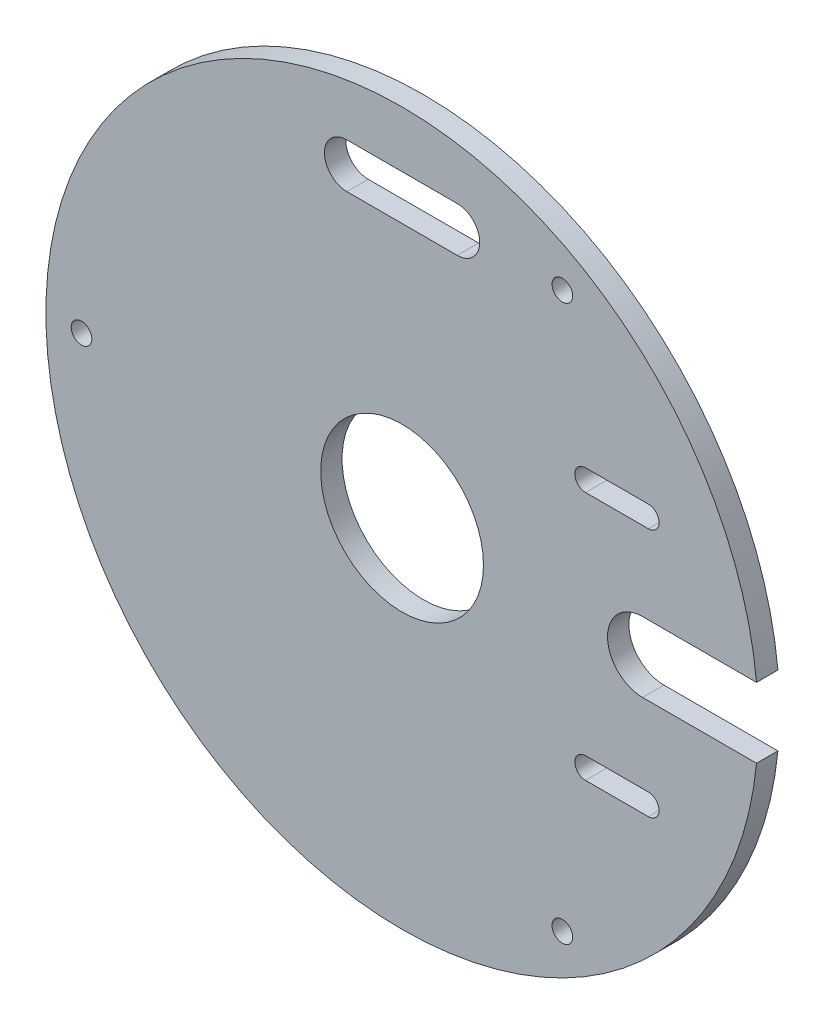
ISO-10303-21;
HEADER;
FILE_DESCRIPTION(('STEP AP214'),'2;1');
FILE_NAME('part.step','',(''),(''),'','','');
FILE_SCHEMA(('AUTOMOTIVE_DESIGN { 1 0 10303 214 1 1 1 1 }'));
ENDSEC;
DATA;
#1=APPLICATION_CONTEXT('core data for automotive mechanical design processes');
#2=APPLICATION_PROTOCOL_DEFINITION('international standard','automotive_design',2000,#1);
#3=PRODUCT_CONTEXT('',#1,'mechanical');
#4=PRODUCT('Part','Part','',(#3));
#5=PRODUCT_RELATED_PRODUCT_CATEGORY('part','',(#4));
#6=PRODUCT_DEFINITION_FORMATION('','',#4);
#7=PRODUCT_DEFINITION_CONTEXT('part definition',#1,'design');
#8=PRODUCT_DEFINITION('design','',#6,#7);
#9=PRODUCT_DEFINITION_SHAPE('','',#8);
#10=(LENGTH_UNIT() NAMED_UNIT(*) SI_UNIT(.MILLI.,.METRE.));
#11=(NAMED_UNIT(*) PLANE_ANGLE_UNIT() SI_UNIT($,.RADIAN.));
#12=(NAMED_UNIT(*) SI_UNIT($,.STERADIAN.) SOLID_ANGLE_UNIT());
#13=UNCERTAINTY_MEASURE_WITH_UNIT(LENGTH_MEASURE(1.E-05),#10,'distance_accuracy_value','');
#14=(GEOMETRIC_REPRESENTATION_CONTEXT(3) GLOBAL_UNCERTAINTY_ASSIGNED_CONTEXT((#13)) GLOBAL_UNIT_ASSIGNED_CONTEXT((#10,
#11,#12)) REPRESENTATION_CONTEXT('',''));
#15=CARTESIAN_POINT('',(0.,0.,0.));
#16=DIRECTION('',(0.,0.,1.));
#17=DIRECTION('',(1.,0.,0.));
#18=AXIS2_PLACEMENT_3D('',#15,#16,#17);
#19=CARTESIAN_POINT('',(22.5,-38.9711431702997,3.));
#20=DIRECTION('',(0.,0.,-1.));
#21=DIRECTION('',(-1.,0.,0.));
#22=AXIS2_PLACEMENT_3D('',#19,#20,#21);
#23=CYLINDRICAL_SURFACE('',#22,1.45);
#24=CARTESIAN_POINT('',(22.5,-38.9711431702997,3.));
#25=DIRECTION('',(0.,0.,1.));
#26=DIRECTION('',(1.,0.,0.));
#27=AXIS2_PLACEMENT_3D('',#24,#25,#26);
#28=CIRCLE('',#27,1.45);
#29=CARTESIAN_POINT('',(23.95,-38.9711431702997,3.));
#30=VERTEX_POINT('',#29);
#31=EDGE_CURVE('E296',#30,#30,#28,.T.);
#32=ORIENTED_EDGE('',*,*,#31,.T.);
#33=EDGE_LOOP('',(#32));
#34=FACE_BOUND('',#33,.T.);
#35=CARTESIAN_POINT('',(22.5,-38.9711431702997,0.));
#36=DIRECTION('',(0.,0.,1.));
#37=DIRECTION('',(1.,0.,0.));
#38=AXIS2_PLACEMENT_3D('',#35,#36,#37);
#39=CIRCLE('',#38,1.45);
#40=CARTESIAN_POINT('',(23.95,-38.9711431702997,0.));
#41=VERTEX_POINT('',#40);
#42=EDGE_CURVE('E277',#41,#41,#39,.T.);
#43=ORIENTED_EDGE('',*,*,#42,.F.);
#44=EDGE_LOOP('',(#43));
#45=FACE_BOUND('',#44,.T.);
#46=ADVANCED_FACE('F41',(#34,#45),#23,.F.);
#47=CARTESIAN_POINT('',(-45.,0.,3.));
#48=DIRECTION('',(0.,0.,-1.));
#49=DIRECTION('',(-1.,0.,0.));
#50=AXIS2_PLACEMENT_3D('',#47,#48,#49);
#51=CYLINDRICAL_SURFACE('',#50,1.45);
#52=CARTESIAN_POINT('',(-45.,0.,3.));
#53=DIRECTION('',(0.,0.,1.));
#54=DIRECTION('',(1.,0.,0.));
#55=AXIS2_PLACEMENT_3D('',#52,#53,#54);
#56=CIRCLE('',#55,1.45);
#57=CARTESIAN_POINT('',(-43.55,0.,3.));
#58=VERTEX_POINT('',#57);
#59=EDGE_CURVE('E301',#58,#58,#56,.T.);
#60=ORIENTED_EDGE('',*,*,#59,.T.);
#61=EDGE_LOOP('',(#60));
#62=FACE_BOUND('',#61,.T.);
#63=CARTESIAN_POINT('',(-45.,0.,0.));
#64=DIRECTION('',(0.,0.,1.));
#65=DIRECTION('',(1.,0.,0.));
#66=AXIS2_PLACEMENT_3D('',#63,#64,#65);
#67=CIRCLE('',#66,1.45);
#68=CARTESIAN_POINT('',(-43.55,0.,0.));
#69=VERTEX_POINT('',#68);
#70=EDGE_CURVE('E283',#69,#69,#67,.T.);
#71=ORIENTED_EDGE('',*,*,#70,.F.);
#72=EDGE_LOOP('',(#71));
#73=FACE_BOUND('',#72,.T.);
#74=ADVANCED_FACE('F412',(#62,#73),#51,.F.);
#75=CARTESIAN_POINT('',(22.5,38.9711431702997,3.));
#76=DIRECTION('',(0.,0.,-1.));
#77=DIRECTION('',(-1.,0.,0.));
#78=AXIS2_PLACEMENT_3D('',#75,#76,#77);
#79=CYLINDRICAL_SURFACE('',#78,1.45);
#80=CARTESIAN_POINT('',(22.5,38.9711431702997,3.));
#81=DIRECTION('',(0.,0.,1.));
#82=DIRECTION('',(1.,0.,0.));
#83=AXIS2_PLACEMENT_3D('',#80,#81,#82);
#84=CIRCLE('',#83,1.45);
#85=CARTESIAN_POINT('',(23.95,38.9711431702997,3.));
#86=VERTEX_POINT('',#85);
#87=EDGE_CURVE('E280',#86,#86,#84,.T.);
#88=ORIENTED_EDGE('',*,*,#87,.T.);
#89=EDGE_LOOP('',(#88));
#90=FACE_BOUND('',#89,.T.);
#91=CARTESIAN_POINT('',(22.5,38.9711431702997,0.));
#92=DIRECTION('',(0.,0.,1.));
#93=DIRECTION('',(1.,0.,0.));
#94=AXIS2_PLACEMENT_3D('',#91,#92,#93);
#95=CIRCLE('',#94,1.45);
#96=CARTESIAN_POINT('',(23.95,38.9711431702997,0.));
#97=VERTEX_POINT('',#96);
#98=EDGE_CURVE('E288',#97,#97,#95,.T.);
#99=ORIENTED_EDGE('',*,*,#98,.F.);
#100=EDGE_LOOP('',(#99));
#101=FACE_BOUND('',#100,.T.);
#102=ADVANCED_FACE('F418',(#90,#101),#79,.F.);
#103=CARTESIAN_POINT('',(0.,0.,3.));
#104=DIRECTION('',(0.,0.,-1.));
#105=DIRECTION('',(-1.,0.,0.));
#106=AXIS2_PLACEMENT_3D('',#103,#104,#105);
#107=CYLINDRICAL_SURFACE('',#106,11.425);
#108=CARTESIAN_POINT('',(0.,0.,3.));
#109=DIRECTION('',(0.,0.,1.));
#110=DIRECTION('',(1.,0.,0.));
#111=AXIS2_PLACEMENT_3D('',#108,#109,#110);
#112=CIRCLE('',#111,11.425);
#113=CARTESIAN_POINT('',(11.425,0.,3.));
#114=VERTEX_POINT('',#113);
#115=EDGE_CURVE('E276',#114,#114,#112,.T.);
#116=ORIENTED_EDGE('',*,*,#115,.T.);
#117=EDGE_LOOP('',(#116));
#118=FACE_BOUND('',#117,.T.);
#119=CARTESIAN_POINT('',(0.,0.,0.));
#120=DIRECTION('',(0.,0.,1.));
#121=DIRECTION('',(1.,0.,0.));
#122=AXIS2_PLACEMENT_3D('',#119,#120,#121);
#123=CIRCLE('',#122,11.425);
#124=CARTESIAN_POINT('',(11.425,0.,0.));
#125=VERTEX_POINT('',#124);
#126=EDGE_CURVE('E291',#125,#125,#123,.T.);
#127=ORIENTED_EDGE('',*,*,#126,.F.);
#128=EDGE_LOOP('',(#127));
#129=FACE_BOUND('',#128,.T.);
#130=ADVANCED_FACE('F43',(#118,#129),#107,.F.);
#131=CARTESIAN_POINT('',(0.,0.,3.));
#132=DIRECTION('',(0.,0.,-1.));
#133=DIRECTION('',(-1.,0.,0.));
#134=AXIS2_PLACEMENT_3D('',#131,#132,#133);
#135=CYLINDRICAL_SURFACE('',#134,50.);
#136=CARTESIAN_POINT('',(0.,0.,3.));
#137=DIRECTION('',(0.,0.,1.));
#138=DIRECTION('',(1.,0.,0.));
#139=AXIS2_PLACEMENT_3D('',#136,#137,#138);
#140=CIRCLE('',#139,50.);
#141=CARTESIAN_POINT('',(49.7579720691289,4.91367638004216,3.));
#142=VERTEX_POINT('',#141);
#143=CARTESIAN_POINT('',(49.7579720691289,-4.91367638004216,3.));
#144=VERTEX_POINT('',#143);
#145=EDGE_CURVE('E49',#142,#144,#140,.T.);
#146=ORIENTED_EDGE('',*,*,#145,.F.);
#147=DIRECTION('',(0.,0.,-1.));
#148=VECTOR('',#147,1.);
#149=CARTESIAN_POINT('',(49.7579720691289,4.91367638004216,3.));
#150=LINE('',#149,#148);
#151=CARTESIAN_POINT('',(49.7579720691289,4.91367638004216,0.));
#152=VERTEX_POINT('',#151);
#153=EDGE_CURVE('E234',#142,#152,#150,.T.);
#154=ORIENTED_EDGE('',*,*,#153,.T.);
#155=CARTESIAN_POINT('',(0.,0.,0.));
#156=DIRECTION('',(0.,0.,1.));
#157=DIRECTION('',(1.,0.,0.));
#158=AXIS2_PLACEMENT_3D('',#155,#156,#157);
#159=CIRCLE('',#158,50.);
#160=CARTESIAN_POINT('',(49.7579720691289,-4.91367638004216,0.));
#161=VERTEX_POINT('',#160);
#162=EDGE_CURVE('E268',#152,#161,#159,.T.);
#163=ORIENTED_EDGE('',*,*,#162,.T.);
#164=DIRECTION('',(0.,0.,-1.));
#165=VECTOR('',#164,1.);
#166=CARTESIAN_POINT('',(49.7579720691289,-4.91367638004216,3.));
#167=LINE('',#166,#165);
#168=EDGE_CURVE('E216',#161,#144,#167,.F.);
#169=ORIENTED_EDGE('',*,*,#168,.T.);
#170=EDGE_LOOP('',(#146,#154,#163,#169));
#171=FACE_BOUND('',#170,.T.);
#172=ADVANCED_FACE('F266',(#171),#135,.T.);
#173=CARTESIAN_POINT('',(0.,0.,3.));
#174=DIRECTION('',(0.,0.,1.));
#175=DIRECTION('',(1.,0.,0.));
#176=AXIS2_PLACEMENT_3D('',#173,#174,#175);
#177=PLANE('',#176);
#178=CARTESIAN_POINT('',(34.5735541658757,-17.5,3.));
#179=DIRECTION('',(0.,0.,1.));
#180=DIRECTION('',(1.,0.,0.));
#181=AXIS2_PLACEMENT_3D('',#178,#179,#180);
#182=CIRCLE('',#181,1.5);
#183=CARTESIAN_POINT('',(34.5735541658757,-19.,3.));
#184=VERTEX_POINT('',#183);
#185=CARTESIAN_POINT('',(34.5735541658757,-16.,3.));
#186=VERTEX_POINT('',#185);
#187=EDGE_CURVE('E367',#184,#186,#182,.T.);
#188=ORIENTED_EDGE('',*,*,#187,.F.);
#189=DIRECTION('',(1.,0.,0.));
#190=VECTOR('',#189,1.);
#191=CARTESIAN_POINT('',(0.,-19.,3.));
#192=LINE('',#191,#190);
#193=CARTESIAN_POINT('',(25.7538897565406,-19.,3.));
#194=VERTEX_POINT('',#193);
#195=EDGE_CURVE('E250',#194,#184,#192,.T.);
#196=ORIENTED_EDGE('',*,*,#195,.F.);
#197=CARTESIAN_POINT('',(25.7538897565406,-17.5,3.));
#198=DIRECTION('',(0.,0.,1.));
#199=DIRECTION('',(1.,0.,0.));
#200=AXIS2_PLACEMENT_3D('',#197,#198,#199);
#201=CIRCLE('',#200,1.5);
#202=CARTESIAN_POINT('',(25.7538897565406,-16.,3.));
#203=VERTEX_POINT('',#202);
#204=EDGE_CURVE('E376',#203,#194,#201,.T.);
#205=ORIENTED_EDGE('',*,*,#204,.F.);
#206=DIRECTION('',(-1.,0.,0.));
#207=VECTOR('',#206,1.);
#208=CARTESIAN_POINT('',(0.,-16.,3.));
#209=LINE('',#208,#207);
#210=EDGE_CURVE('E369',#186,#203,#209,.T.);
#211=ORIENTED_EDGE('',*,*,#210,.F.);
#212=EDGE_LOOP('',(#188,#196,#205,#211));
#213=FACE_BOUND('',#212,.T.);
#214=CARTESIAN_POINT('',(34.5735541658757,17.5,3.));
#215=DIRECTION('',(0.,0.,1.));
#216=DIRECTION('',(1.,0.,0.));
#217=AXIS2_PLACEMENT_3D('',#214,#215,#216);
#218=CIRCLE('',#217,1.5);
#219=CARTESIAN_POINT('',(34.5735541658757,16.,3.));
#220=VERTEX_POINT('',#219);
#221=CARTESIAN_POINT('',(34.5735541658757,19.,3.));
#222=VERTEX_POINT('',#221);
#223=EDGE_CURVE('E245',#220,#222,#218,.T.);
#224=ORIENTED_EDGE('',*,*,#223,.F.);
#225=DIRECTION('',(1.,0.,0.));
#226=VECTOR('',#225,1.);
#227=CARTESIAN_POINT('',(0.,16.,3.));
#228=LINE('',#227,#226);
#229=CARTESIAN_POINT('',(25.7538897565406,16.,3.));
#230=VERTEX_POINT('',#229);
#231=EDGE_CURVE('E257',#230,#220,#228,.T.);
#232=ORIENTED_EDGE('',*,*,#231,.F.);
#233=CARTESIAN_POINT('',(25.7538897565406,17.5,3.));
#234=DIRECTION('',(0.,0.,1.));
#235=DIRECTION('',(1.,0.,0.));
#236=AXIS2_PLACEMENT_3D('',#233,#234,#235);
#237=CIRCLE('',#236,1.5);
#238=CARTESIAN_POINT('',(25.7538897565406,19.,3.));
#239=VERTEX_POINT('',#238);
#240=EDGE_CURVE('E159',#239,#230,#237,.T.);
#241=ORIENTED_EDGE('',*,*,#240,.F.);
#242=DIRECTION('',(-1.,0.,0.));
#243=VECTOR('',#242,1.);
#244=CARTESIAN_POINT('',(0.,19.,3.));
#245=LINE('',#244,#243);
#246=EDGE_CURVE('E241',#222,#239,#245,.T.);
#247=ORIENTED_EDGE('',*,*,#246,.F.);
#248=EDGE_LOOP('',(#224,#232,#241,#247));
#249=FACE_BOUND('',#248,.T.);
#250=DIRECTION('',(-1.,0.,0.));
#251=VECTOR('',#250,1.);
#252=CARTESIAN_POINT('',(0.,4.91367638004216,3.));
#253=LINE('',#252,#251);
#254=CARTESIAN_POINT('',(33.7538897565406,4.91367638004216,3.));
#255=VERTEX_POINT('',#254);
#256=EDGE_CURVE('E230',#142,#255,#253,.T.);
#257=ORIENTED_EDGE('',*,*,#256,.F.);
#258=ORIENTED_EDGE('',*,*,#145,.T.);
#259=DIRECTION('',(1.,0.,0.));
#260=VECTOR('',#259,1.);
#261=CARTESIAN_POINT('',(0.,-4.91367638004216,3.));
#262=LINE('',#261,#260);
#263=CARTESIAN_POINT('',(33.7538897565406,-4.91367638004216,3.));
#264=VERTEX_POINT('',#263);
#265=EDGE_CURVE('E211',#264,#144,#262,.T.);
#266=ORIENTED_EDGE('',*,*,#265,.F.);
#267=CARTESIAN_POINT('',(33.7538897565406,0.,3.));
#268=DIRECTION('',(0.,0.,1.));
#269=DIRECTION('',(1.,0.,0.));
#270=AXIS2_PLACEMENT_3D('',#267,#268,#269);
#271=CIRCLE('',#270,4.91367638004216);
#272=EDGE_CURVE('E226',#255,#264,#271,.T.);
#273=ORIENTED_EDGE('',*,*,#272,.F.);
#274=EDGE_LOOP('',(#257,#258,#266,#273));
#275=FACE_BOUND('',#274,.T.);
#276=CARTESIAN_POINT('',(7.75,38.9711431702997,3.));
#277=DIRECTION('',(0.,0.,1.));
#278=DIRECTION('',(1.,0.,0.));
#279=AXIS2_PLACEMENT_3D('',#276,#277,#278);
#280=CIRCLE('',#279,3.14884540248456);
#281=CARTESIAN_POINT('',(7.75,35.8222977678152,3.));
#282=VERTEX_POINT('',#281);
#283=CARTESIAN_POINT('',(7.75,42.1199885727843,3.));
#284=VERTEX_POINT('',#283);
#285=EDGE_CURVE('E327',#282,#284,#280,.T.);
#286=ORIENTED_EDGE('',*,*,#285,.F.);
#287=DIRECTION('',(1.,0.,0.));
#288=VECTOR('',#287,1.);
#289=CARTESIAN_POINT('',(0.,35.8222977678152,3.));
#290=LINE('',#289,#288);
#291=CARTESIAN_POINT('',(-7.75,35.8222977678152,3.));
#292=VERTEX_POINT('',#291);
#293=EDGE_CURVE('E321',#292,#282,#290,.T.);
#294=ORIENTED_EDGE('',*,*,#293,.F.);
#295=CARTESIAN_POINT('',(-7.75,38.9711431702997,3.));
#296=DIRECTION('',(0.,0.,1.));
#297=DIRECTION('',(1.,0.,0.));
#298=AXIS2_PLACEMENT_3D('',#295,#296,#297);
#299=CIRCLE('',#298,3.14884540248456);
#300=CARTESIAN_POINT('',(-7.75,42.1199885727843,3.));
#301=VERTEX_POINT('',#300);
#302=EDGE_CURVE('E293',#301,#292,#299,.T.);
#303=ORIENTED_EDGE('',*,*,#302,.F.);
#304=DIRECTION('',(1.,0.,0.));
#305=VECTOR('',#304,1.);
#306=CARTESIAN_POINT('',(0.,42.1199885727843,3.));
#307=LINE('',#306,#305);
#308=EDGE_CURVE('E364',#301,#284,#307,.T.);
#309=ORIENTED_EDGE('',*,*,#308,.T.);
#310=EDGE_LOOP('',(#286,#294,#303,#309));
#311=FACE_BOUND('',#310,.T.);
#312=ORIENTED_EDGE('',*,*,#115,.F.);
#313=EDGE_LOOP('',(#312));
#314=FACE_BOUND('',#313,.T.);
#315=ORIENTED_EDGE('',*,*,#87,.F.);
#316=EDGE_LOOP('',(#315));
#317=FACE_BOUND('',#316,.T.);
#318=ORIENTED_EDGE('',*,*,#59,.F.);
#319=EDGE_LOOP('',(#318));
#320=FACE_BOUND('',#319,.T.);
#321=ORIENTED_EDGE('',*,*,#31,.F.);
#322=EDGE_LOOP('',(#321));
#323=FACE_BOUND('',#322,.T.);
#324=ADVANCED_FACE('F362',(#213,#249,#275,#311,#314,#317,#320,#323),#177,.T.);
#325=CARTESIAN_POINT('',(0.,0.,0.));
#326=DIRECTION('',(0.,0.,1.));
#327=DIRECTION('',(1.,0.,0.));
#328=AXIS2_PLACEMENT_3D('',#325,#326,#327);
#329=PLANE('',#328);
#330=DIRECTION('',(-1.,0.,0.));
#331=VECTOR('',#330,1.);
#332=CARTESIAN_POINT('',(34.5735541658757,-19.,0.));
#333=LINE('',#332,#331);
#334=CARTESIAN_POINT('',(34.5735541658757,-19.,0.));
#335=VERTEX_POINT('',#334);
#336=CARTESIAN_POINT('',(25.7538897565406,-19.,0.));
#337=VERTEX_POINT('',#336);
#338=EDGE_CURVE('E188',#335,#337,#333,.T.);
#339=ORIENTED_EDGE('',*,*,#338,.F.);
#340=CARTESIAN_POINT('',(34.5735541658757,-17.5,0.));
#341=DIRECTION('',(0.,0.,-1.));
#342=DIRECTION('',(1.,0.,0.));
#343=AXIS2_PLACEMENT_3D('',#340,#341,#342);
#344=CIRCLE('',#343,1.5);
#345=CARTESIAN_POINT('',(34.5735541658757,-16.,0.));
#346=VERTEX_POINT('',#345);
#347=EDGE_CURVE('E186',#346,#335,#344,.T.);
#348=ORIENTED_EDGE('',*,*,#347,.F.);
#349=DIRECTION('',(1.,0.,0.));
#350=VECTOR('',#349,1.);
#351=CARTESIAN_POINT('',(34.5735541658757,-16.,0.));
#352=LINE('',#351,#350);
#353=CARTESIAN_POINT('',(25.7538897565406,-16.,0.));
#354=VERTEX_POINT('',#353);
#355=EDGE_CURVE('E193',#354,#346,#352,.T.);
#356=ORIENTED_EDGE('',*,*,#355,.F.);
#357=CARTESIAN_POINT('',(25.7538897565406,-17.5,0.));
#358=DIRECTION('',(0.,0.,-1.));
#359=DIRECTION('',(1.,0.,0.));
#360=AXIS2_PLACEMENT_3D('',#357,#358,#359);
#361=CIRCLE('',#360,1.5);
#362=EDGE_CURVE('E190',#337,#354,#361,.T.);
#363=ORIENTED_EDGE('',*,*,#362,.F.);
#364=EDGE_LOOP('',(#339,#348,#356,#363));
#365=FACE_BOUND('',#364,.T.);
#366=DIRECTION('',(-1.,0.,0.));
#367=VECTOR('',#366,1.);
#368=CARTESIAN_POINT('',(34.5735541658757,16.,0.));
#369=LINE('',#368,#367);
#370=CARTESIAN_POINT('',(34.5735541658757,16.,0.));
#371=VERTEX_POINT('',#370);
#372=CARTESIAN_POINT('',(25.7538897565406,16.,0.));
#373=VERTEX_POINT('',#372);
#374=EDGE_CURVE('E166',#371,#373,#369,.T.);
#375=ORIENTED_EDGE('',*,*,#374,.F.);
#376=CARTESIAN_POINT('',(34.5735541658757,17.5,0.));
#377=DIRECTION('',(0.,0.,-1.));
#378=DIRECTION('',(-1.,0.,0.));
#379=AXIS2_PLACEMENT_3D('',#376,#377,#378);
#380=CIRCLE('',#379,1.5);
#381=CARTESIAN_POINT('',(34.5735541658757,19.,0.));
#382=VERTEX_POINT('',#381);
#383=EDGE_CURVE('E171',#382,#371,#380,.T.);
#384=ORIENTED_EDGE('',*,*,#383,.F.);
#385=DIRECTION('',(1.,0.,0.));
#386=VECTOR('',#385,1.);
#387=CARTESIAN_POINT('',(34.5735541658757,19.,0.));
#388=LINE('',#387,#386);
#389=CARTESIAN_POINT('',(25.7538897565406,19.,0.));
#390=VERTEX_POINT('',#389);
#391=EDGE_CURVE('E176',#390,#382,#388,.T.);
#392=ORIENTED_EDGE('',*,*,#391,.F.);
#393=CARTESIAN_POINT('',(25.7538897565406,17.5,0.));
#394=DIRECTION('',(0.,0.,-1.));
#395=DIRECTION('',(-1.,0.,0.));
#396=AXIS2_PLACEMENT_3D('',#393,#394,#395);
#397=CIRCLE('',#396,1.5);
#398=EDGE_CURVE('E156',#373,#390,#397,.T.);
#399=ORIENTED_EDGE('',*,*,#398,.F.);
#400=EDGE_LOOP('',(#375,#384,#392,#399));
#401=FACE_BOUND('',#400,.T.);
#402=DIRECTION('',(1.,0.,0.));
#403=VECTOR('',#402,1.);
#404=CARTESIAN_POINT('',(0.,35.8222977678152,0.));
#405=LINE('',#404,#403);
#406=CARTESIAN_POINT('',(-7.75,35.8222977678152,0.));
#407=VERTEX_POINT('',#406);
#408=CARTESIAN_POINT('',(7.75,35.8222977678152,0.));
#409=VERTEX_POINT('',#408);
#410=EDGE_CURVE('E326',#407,#409,#405,.T.);
#411=ORIENTED_EDGE('',*,*,#410,.T.);
#412=CARTESIAN_POINT('',(7.75,38.9711431702997,0.));
#413=DIRECTION('',(0.,0.,1.));
#414=DIRECTION('',(1.,0.,0.));
#415=AXIS2_PLACEMENT_3D('',#412,#413,#414);
#416=CIRCLE('',#415,3.14884540248456);
#417=CARTESIAN_POINT('',(7.75,42.1199885727843,0.));
#418=VERTEX_POINT('',#417);
#419=EDGE_CURVE('E331',#409,#418,#416,.T.);
#420=ORIENTED_EDGE('',*,*,#419,.T.);
#421=DIRECTION('',(1.,0.,0.));
#422=VECTOR('',#421,1.);
#423=CARTESIAN_POINT('',(0.,42.1199885727843,0.));
#424=LINE('',#423,#422);
#425=CARTESIAN_POINT('',(-7.75,42.1199885727843,0.));
#426=VERTEX_POINT('',#425);
#427=EDGE_CURVE('E334',#426,#418,#424,.T.);
#428=ORIENTED_EDGE('',*,*,#427,.F.);
#429=CARTESIAN_POINT('',(-7.75,38.9711431702997,0.));
#430=DIRECTION('',(0.,0.,1.));
#431=DIRECTION('',(1.,0.,0.));
#432=AXIS2_PLACEMENT_3D('',#429,#430,#431);
#433=CIRCLE('',#432,3.14884540248456);
#434=EDGE_CURVE('E337',#426,#407,#433,.T.);
#435=ORIENTED_EDGE('',*,*,#434,.T.);
#436=EDGE_LOOP('',(#411,#420,#428,#435));
#437=FACE_BOUND('',#436,.T.);
#438=ORIENTED_EDGE('',*,*,#126,.T.);
#439=EDGE_LOOP('',(#438));
#440=FACE_BOUND('',#439,.T.);
#441=ORIENTED_EDGE('',*,*,#98,.T.);
#442=EDGE_LOOP('',(#441));
#443=FACE_BOUND('',#442,.T.);
#444=ORIENTED_EDGE('',*,*,#70,.T.);
#445=EDGE_LOOP('',(#444));
#446=FACE_BOUND('',#445,.T.);
#447=ORIENTED_EDGE('',*,*,#42,.T.);
#448=EDGE_LOOP('',(#447));
#449=FACE_BOUND('',#448,.T.);
#450=ORIENTED_EDGE('',*,*,#162,.F.);
#451=DIRECTION('',(1.,0.,0.));
#452=VECTOR('',#451,1.);
#453=CARTESIAN_POINT('',(50.4926761863821,4.91367638004216,0.));
#454=LINE('',#453,#452);
#455=CARTESIAN_POINT('',(33.7538897565406,4.91367638004216,0.));
#456=VERTEX_POINT('',#455);
#457=EDGE_CURVE('E206',#456,#152,#454,.T.);
#458=ORIENTED_EDGE('',*,*,#457,.F.);
#459=CARTESIAN_POINT('',(33.7538897565406,0.,0.));
#460=DIRECTION('',(0.,0.,-1.));
#461=DIRECTION('',(-1.,0.,0.));
#462=AXIS2_PLACEMENT_3D('',#459,#460,#461);
#463=CIRCLE('',#462,4.91367638004216);
#464=CARTESIAN_POINT('',(33.7538897565406,-4.91367638004216,0.));
#465=VERTEX_POINT('',#464);
#466=EDGE_CURVE('E183',#465,#456,#463,.T.);
#467=ORIENTED_EDGE('',*,*,#466,.F.);
#468=DIRECTION('',(1.,0.,0.));
#469=VECTOR('',#468,1.);
#470=CARTESIAN_POINT('',(0.,-4.91367638004216,0.));
#471=LINE('',#470,#469);
#472=EDGE_CURVE('E12',#465,#161,#471,.T.);
#473=ORIENTED_EDGE('',*,*,#472,.T.);
#474=EDGE_LOOP('',(#450,#458,#467,#473));
#475=FACE_BOUND('',#474,.T.);
#476=ADVANCED_FACE('F173',(#365,#401,#437,#440,#443,#446,#449,#475),#329,.F.);
#477=CARTESIAN_POINT('',(0.,35.8222977678152,3.001));
#478=DIRECTION('',(0.,1.,0.));
#479=DIRECTION('',(0.,0.,1.));
#480=AXIS2_PLACEMENT_3D('',#477,#478,#479);
#481=PLANE('',#480);
#482=ORIENTED_EDGE('',*,*,#293,.T.);
#483=DIRECTION('',(0.,0.,-1.));
#484=VECTOR('',#483,1.);
#485=CARTESIAN_POINT('',(7.75,35.8222977678152,3.001));
#486=LINE('',#485,#484);
#487=EDGE_CURVE('E318',#282,#409,#486,.T.);
#488=ORIENTED_EDGE('',*,*,#487,.T.);
#489=ORIENTED_EDGE('',*,*,#410,.F.);
#490=DIRECTION('',(0.,0.,-1.));
#491=VECTOR('',#490,1.);
#492=CARTESIAN_POINT('',(-7.75,35.8222977678152,3.001));
#493=LINE('',#492,#491);
#494=EDGE_CURVE('E340',#292,#407,#493,.T.);
#495=ORIENTED_EDGE('',*,*,#494,.F.);
#496=EDGE_LOOP('',(#482,#488,#489,#495));
#497=FACE_BOUND('',#496,.T.);
#498=ADVANCED_FACE('F349',(#497),#481,.T.);
#499=CARTESIAN_POINT('',(7.75,38.9711431702997,3.001));
#500=DIRECTION('',(0.,0.,-1.));
#501=DIRECTION('',(-1.,0.,0.));
#502=AXIS2_PLACEMENT_3D('',#499,#500,#501);
#503=CYLINDRICAL_SURFACE('',#502,3.14884540248456);
#504=ORIENTED_EDGE('',*,*,#285,.T.);
#505=DIRECTION('',(0.,0.,-1.));
#506=VECTOR('',#505,1.);
#507=CARTESIAN_POINT('',(7.75,42.1199885727843,3.001));
#508=LINE('',#507,#506);
#509=EDGE_CURVE('E344',#284,#418,#508,.T.);
#510=ORIENTED_EDGE('',*,*,#509,.T.);
#511=ORIENTED_EDGE('',*,*,#419,.F.);
#512=ORIENTED_EDGE('',*,*,#487,.F.);
#513=EDGE_LOOP('',(#504,#510,#511,#512));
#514=FACE_BOUND('',#513,.T.);
#515=ADVANCED_FACE('F352',(#514),#503,.F.);
#516=CARTESIAN_POINT('',(0.,42.1199885727843,3.001));
#517=DIRECTION('',(0.,1.,0.));
#518=DIRECTION('',(0.,0.,1.));
#519=AXIS2_PLACEMENT_3D('',#516,#517,#518);
#520=PLANE('',#519);
#521=DIRECTION('',(0.,0.,-1.));
#522=VECTOR('',#521,1.);
#523=CARTESIAN_POINT('',(-7.75,42.1199885727843,3.001));
#524=LINE('',#523,#522);
#525=EDGE_CURVE('E343',#301,#426,#524,.T.);
#526=ORIENTED_EDGE('',*,*,#525,.T.);
#527=ORIENTED_EDGE('',*,*,#427,.T.);
#528=ORIENTED_EDGE('',*,*,#509,.F.);
#529=ORIENTED_EDGE('',*,*,#308,.F.);
#530=EDGE_LOOP('',(#526,#527,#528,#529));
#531=FACE_BOUND('',#530,.T.);
#532=ADVANCED_FACE('F567',(#531),#520,.F.);
#533=CARTESIAN_POINT('',(-7.75,38.9711431702997,3.001));
#534=DIRECTION('',(0.,0.,-1.));
#535=DIRECTION('',(-1.,0.,0.));
#536=AXIS2_PLACEMENT_3D('',#533,#534,#535);
#537=CYLINDRICAL_SURFACE('',#536,3.14884540248456);
#538=ORIENTED_EDGE('',*,*,#302,.T.);
#539=ORIENTED_EDGE('',*,*,#494,.T.);
#540=ORIENTED_EDGE('',*,*,#434,.F.);
#541=ORIENTED_EDGE('',*,*,#525,.F.);
#542=EDGE_LOOP('',(#538,#539,#540,#541));
#543=FACE_BOUND('',#542,.T.);
#544=ADVANCED_FACE('F358',(#543),#537,.F.);
#545=CARTESIAN_POINT('',(50.4926761863821,4.91367638004216,10.));
#546=DIRECTION('',(0.,1.,0.));
#547=DIRECTION('',(0.,0.,1.));
#548=AXIS2_PLACEMENT_3D('',#545,#546,#547);
#549=PLANE('',#548);
#550=ORIENTED_EDGE('',*,*,#256,.T.);
#551=DIRECTION('',(0.,0.,-1.));
#552=VECTOR('',#551,1.);
#553=CARTESIAN_POINT('',(33.7538897565406,4.91367638004216,10.));
#554=LINE('',#553,#552);
#555=EDGE_CURVE('E209',#255,#456,#554,.T.);
#556=ORIENTED_EDGE('',*,*,#555,.T.);
#557=ORIENTED_EDGE('',*,*,#457,.T.);
#558=ORIENTED_EDGE('',*,*,#153,.F.);
#559=EDGE_LOOP('',(#550,#556,#557,#558));
#560=FACE_BOUND('',#559,.T.);
#561=ADVANCED_FACE('F467',(#560),#549,.F.);
#562=CARTESIAN_POINT('',(50.4926761863821,-4.91367638004216,10.));
#563=DIRECTION('',(0.,-1.,0.));
#564=DIRECTION('',(0.,0.,-1.));
#565=AXIS2_PLACEMENT_3D('',#562,#563,#564);
#566=PLANE('',#565);
#567=ORIENTED_EDGE('',*,*,#472,.F.);
#568=DIRECTION('',(0.,0.,-1.));
#569=VECTOR('',#568,1.);
#570=CARTESIAN_POINT('',(33.7538897565406,-4.91367638004216,10.));
#571=LINE('',#570,#569);
#572=EDGE_CURVE('E208',#264,#465,#571,.T.);
#573=ORIENTED_EDGE('',*,*,#572,.F.);
#574=ORIENTED_EDGE('',*,*,#265,.T.);
#575=ORIENTED_EDGE('',*,*,#168,.F.);
#576=EDGE_LOOP('',(#567,#573,#574,#575));
#577=FACE_BOUND('',#576,.T.);
#578=ADVANCED_FACE('F472',(#577),#566,.F.);
#579=CARTESIAN_POINT('',(33.7538897565406,0.,10.));
#580=DIRECTION('',(0.,0.,-1.));
#581=DIRECTION('',(-1.,0.,0.));
#582=AXIS2_PLACEMENT_3D('',#579,#580,#581);
#583=CYLINDRICAL_SURFACE('',#582,4.91367638004216);
#584=ORIENTED_EDGE('',*,*,#272,.T.);
#585=ORIENTED_EDGE('',*,*,#572,.T.);
#586=ORIENTED_EDGE('',*,*,#466,.T.);
#587=ORIENTED_EDGE('',*,*,#555,.F.);
#588=EDGE_LOOP('',(#584,#585,#586,#587));
#589=FACE_BOUND('',#588,.T.);
#590=ADVANCED_FACE('F483',(#589),#583,.F.);
#591=CARTESIAN_POINT('',(34.5735541658757,17.5,10.));
#592=DIRECTION('',(0.,0.,-1.));
#593=DIRECTION('',(-1.,0.,0.));
#594=AXIS2_PLACEMENT_3D('',#591,#592,#593);
#595=CYLINDRICAL_SURFACE('',#594,1.5);
#596=ORIENTED_EDGE('',*,*,#223,.T.);
#597=DIRECTION('',(0.,0.,-1.));
#598=VECTOR('',#597,1.);
#599=CARTESIAN_POINT('',(34.5735541658757,19.,10.));
#600=LINE('',#599,#598);
#601=EDGE_CURVE('E181',#222,#382,#600,.T.);
#602=ORIENTED_EDGE('',*,*,#601,.T.);
#603=ORIENTED_EDGE('',*,*,#383,.T.);
#604=DIRECTION('',(0.,0.,-1.));
#605=VECTOR('',#604,1.);
#606=CARTESIAN_POINT('',(34.5735541658757,16.,10.));
#607=LINE('',#606,#605);
#608=EDGE_CURVE('E162',#220,#371,#607,.T.);
#609=ORIENTED_EDGE('',*,*,#608,.F.);
#610=EDGE_LOOP('',(#596,#602,#603,#609));
#611=FACE_BOUND('',#610,.T.);
#612=ADVANCED_FACE('F493',(#611),#595,.F.);
#613=CARTESIAN_POINT('',(34.5735541658757,19.,10.));
#614=DIRECTION('',(0.,1.,0.));
#615=DIRECTION('',(0.,0.,1.));
#616=AXIS2_PLACEMENT_3D('',#613,#614,#615);
#617=PLANE('',#616);
#618=ORIENTED_EDGE('',*,*,#246,.T.);
#619=DIRECTION('',(0.,0.,-1.));
#620=VECTOR('',#619,1.);
#621=CARTESIAN_POINT('',(25.7538897565406,19.,10.));
#622=LINE('',#621,#620);
#623=EDGE_CURVE('E161',#239,#390,#622,.T.);
#624=ORIENTED_EDGE('',*,*,#623,.T.);
#625=ORIENTED_EDGE('',*,*,#391,.T.);
#626=ORIENTED_EDGE('',*,*,#601,.F.);
#627=EDGE_LOOP('',(#618,#624,#625,#626));
#628=FACE_BOUND('',#627,.T.);
#629=ADVANCED_FACE('F503',(#628),#617,.F.);
#630=CARTESIAN_POINT('',(25.7538897565406,17.5,10.));
#631=DIRECTION('',(0.,0.,-1.));
#632=DIRECTION('',(-1.,0.,0.));
#633=AXIS2_PLACEMENT_3D('',#630,#631,#632);
#634=CYLINDRICAL_SURFACE('',#633,1.5);
#635=ORIENTED_EDGE('',*,*,#240,.T.);
#636=DIRECTION('',(0.,0.,-1.));
#637=VECTOR('',#636,1.);
#638=CARTESIAN_POINT('',(25.7538897565406,16.,10.));
#639=LINE('',#638,#637);
#640=EDGE_CURVE('E64',#230,#373,#639,.T.);
#641=ORIENTED_EDGE('',*,*,#640,.T.);
#642=ORIENTED_EDGE('',*,*,#398,.T.);
#643=ORIENTED_EDGE('',*,*,#623,.F.);
#644=EDGE_LOOP('',(#635,#641,#642,#643));
#645=FACE_BOUND('',#644,.T.);
#646=ADVANCED_FACE('F153',(#645),#634,.F.);
#647=CARTESIAN_POINT('',(34.5735541658757,16.,10.));
#648=DIRECTION('',(0.,-1.,0.));
#649=DIRECTION('',(0.,0.,-1.));
#650=AXIS2_PLACEMENT_3D('',#647,#648,#649);
#651=PLANE('',#650);
#652=ORIENTED_EDGE('',*,*,#231,.T.);
#653=ORIENTED_EDGE('',*,*,#608,.T.);
#654=ORIENTED_EDGE('',*,*,#374,.T.);
#655=ORIENTED_EDGE('',*,*,#640,.F.);
#656=EDGE_LOOP('',(#652,#653,#654,#655));
#657=FACE_BOUND('',#656,.T.);
#658=ADVANCED_FACE('F167',(#657),#651,.F.);
#659=CARTESIAN_POINT('',(34.5735541658757,-17.5,10.));
#660=DIRECTION('',(0.,0.,-1.));
#661=DIRECTION('',(-1.,0.,0.));
#662=AXIS2_PLACEMENT_3D('',#659,#660,#661);
#663=CYLINDRICAL_SURFACE('',#662,1.5);
#664=ORIENTED_EDGE('',*,*,#187,.T.);
#665=DIRECTION('',(0.,0.,-1.));
#666=VECTOR('',#665,1.);
#667=CARTESIAN_POINT('',(34.5735541658757,-16.,10.));
#668=LINE('',#667,#666);
#669=EDGE_CURVE('E197',#186,#346,#668,.T.);
#670=ORIENTED_EDGE('',*,*,#669,.T.);
#671=ORIENTED_EDGE('',*,*,#347,.T.);
#672=DIRECTION('',(0.,0.,-1.));
#673=VECTOR('',#672,1.);
#674=CARTESIAN_POINT('',(34.5735541658757,-19.,10.));
#675=LINE('',#674,#673);
#676=EDGE_CURVE('E196',#184,#335,#675,.T.);
#677=ORIENTED_EDGE('',*,*,#676,.F.);
#678=EDGE_LOOP('',(#664,#670,#671,#677));
#679=FACE_BOUND('',#678,.T.);
#680=ADVANCED_FACE('F391',(#679),#663,.F.);
#681=CARTESIAN_POINT('',(34.5735541658757,-16.,10.));
#682=DIRECTION('',(0.,1.,0.));
#683=DIRECTION('',(0.,0.,1.));
#684=AXIS2_PLACEMENT_3D('',#681,#682,#683);
#685=PLANE('',#684);
#686=ORIENTED_EDGE('',*,*,#210,.T.);
#687=DIRECTION('',(0.,0.,-1.));
#688=VECTOR('',#687,1.);
#689=CARTESIAN_POINT('',(25.7538897565406,-16.,10.));
#690=LINE('',#689,#688);
#691=EDGE_CURVE('E199',#203,#354,#690,.T.);
#692=ORIENTED_EDGE('',*,*,#691,.T.);
#693=ORIENTED_EDGE('',*,*,#355,.T.);
#694=ORIENTED_EDGE('',*,*,#669,.F.);
#695=EDGE_LOOP('',(#686,#692,#693,#694));
#696=FACE_BOUND('',#695,.T.);
#697=ADVANCED_FACE('F397',(#696),#685,.F.);
#698=CARTESIAN_POINT('',(25.7538897565406,-17.5,10.));
#699=DIRECTION('',(0.,0.,-1.));
#700=DIRECTION('',(-1.,0.,0.));
#701=AXIS2_PLACEMENT_3D('',#698,#699,#700);
#702=CYLINDRICAL_SURFACE('',#701,1.5);
#703=ORIENTED_EDGE('',*,*,#204,.T.);
#704=DIRECTION('',(0.,0.,-1.));
#705=VECTOR('',#704,1.);
#706=CARTESIAN_POINT('',(25.7538897565406,-19.,10.));
#707=LINE('',#706,#705);
#708=EDGE_CURVE('E56',#194,#337,#707,.T.);
#709=ORIENTED_EDGE('',*,*,#708,.T.);
#710=ORIENTED_EDGE('',*,*,#362,.T.);
#711=ORIENTED_EDGE('',*,*,#691,.F.);
#712=EDGE_LOOP('',(#703,#709,#710,#711));
#713=FACE_BOUND('',#712,.T.);
#714=ADVANCED_FACE('F398',(#713),#702,.F.);
#715=CARTESIAN_POINT('',(34.5735541658757,-19.,10.));
#716=DIRECTION('',(0.,-1.,0.));
#717=DIRECTION('',(0.,0.,-1.));
#718=AXIS2_PLACEMENT_3D('',#715,#716,#717);
#719=PLANE('',#718);
#720=ORIENTED_EDGE('',*,*,#195,.T.);
#721=ORIENTED_EDGE('',*,*,#676,.T.);
#722=ORIENTED_EDGE('',*,*,#338,.T.);
#723=ORIENTED_EDGE('',*,*,#708,.F.);
#724=EDGE_LOOP('',(#720,#721,#722,#723));
#725=FACE_BOUND('',#724,.T.);
#726=ADVANCED_FACE('F386',(#725),#719,.F.);
#727=CLOSED_SHELL('',(#46,#74,#102,#130,#172,#324,#476,#498,#515,#532,#544,#561,#578,#590,#612,
#629,#646,#658,#680,#697,#714,#726));
#728=MANIFOLD_SOLID_BREP('B2',#727);
#729=ADVANCED_BREP_SHAPE_REPRESENTATION('',(#18,#728),#14);
#730=SHAPE_DEFINITION_REPRESENTATION(#9,#729);
ENDSEC;
END-ISO-10303-21;
